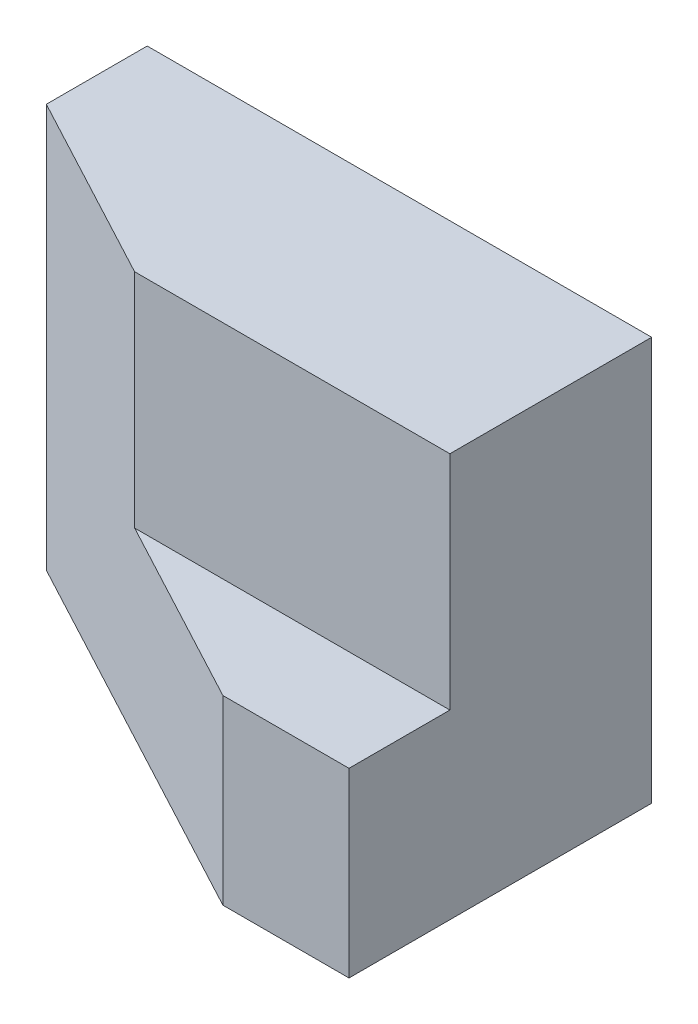
ISO-10303-21;
HEADER;
FILE_DESCRIPTION(('STEP AP214'),'2;1');
FILE_NAME('part.step','',(''),(''),'','','');
FILE_SCHEMA(('AUTOMOTIVE_DESIGN { 1 0 10303 214 1 1 1 1 }'));
ENDSEC;
DATA;
#1=APPLICATION_CONTEXT('core data for automotive mechanical design processes');
#2=APPLICATION_PROTOCOL_DEFINITION('international standard','automotive_design',2000,#1);
#3=PRODUCT_CONTEXT('',#1,'mechanical');
#4=PRODUCT('Part','Part','',(#3));
#5=PRODUCT_RELATED_PRODUCT_CATEGORY('part','',(#4));
#6=PRODUCT_DEFINITION_FORMATION('','',#4);
#7=PRODUCT_DEFINITION_CONTEXT('part definition',#1,'design');
#8=PRODUCT_DEFINITION('design','',#6,#7);
#9=PRODUCT_DEFINITION_SHAPE('','',#8);
#10=(LENGTH_UNIT() NAMED_UNIT(*) SI_UNIT(.MILLI.,.METRE.));
#11=(NAMED_UNIT(*) PLANE_ANGLE_UNIT() SI_UNIT($,.RADIAN.));
#12=(NAMED_UNIT(*) SI_UNIT($,.STERADIAN.) SOLID_ANGLE_UNIT());
#13=UNCERTAINTY_MEASURE_WITH_UNIT(LENGTH_MEASURE(1.E-05),#10,'distance_accuracy_value','');
#14=(GEOMETRIC_REPRESENTATION_CONTEXT(3) GLOBAL_UNCERTAINTY_ASSIGNED_CONTEXT((#13)) GLOBAL_UNIT_ASSIGNED_CONTEXT((#10,
#11,#12)) REPRESENTATION_CONTEXT('',''));
#15=CARTESIAN_POINT('',(0.,0.,0.));
#16=DIRECTION('',(0.,0.,1.));
#17=DIRECTION('',(1.,0.,0.));
#18=AXIS2_PLACEMENT_3D('',#15,#16,#17);
#19=CARTESIAN_POINT('',(0.,80.,0.));
#20=DIRECTION('',(0.,-1.,0.));
#21=DIRECTION('',(0.,0.,-1.));
#22=AXIS2_PLACEMENT_3D('',#19,#20,#21);
#23=PLANE('',#22);
#24=DIRECTION('',(-0.882352941176471,0.,-0.470588235294118));
#25=VECTOR('',#24,1.);
#26=CARTESIAN_POINT('',(75.,80.,60.));
#27=LINE('',#26,#25);
#28=CARTESIAN_POINT('',(37.5,80.,40.));
#29=VERTEX_POINT('',#28);
#30=CARTESIAN_POINT('',(0.,80.,20.));
#31=VERTEX_POINT('',#30);
#32=EDGE_CURVE('E88',#29,#31,#27,.T.);
#33=ORIENTED_EDGE('',*,*,#32,.F.);
#34=DIRECTION('',(1.,0.,0.));
#35=VECTOR('',#34,1.);
#36=CARTESIAN_POINT('',(0.,80.,40.));
#37=LINE('',#36,#35);
#38=CARTESIAN_POINT('',(100.,80.,40.));
#39=VERTEX_POINT('',#38);
#40=EDGE_CURVE('E127',#29,#39,#37,.T.);
#41=ORIENTED_EDGE('',*,*,#40,.T.);
#42=DIRECTION('',(0.,0.,1.));
#43=VECTOR('',#42,1.);
#44=CARTESIAN_POINT('',(100.,80.,0.));
#45=LINE('',#44,#43);
#46=CARTESIAN_POINT('',(100.,80.,0.));
#47=VERTEX_POINT('',#46);
#48=EDGE_CURVE('E285',#47,#39,#45,.T.);
#49=ORIENTED_EDGE('',*,*,#48,.F.);
#50=DIRECTION('',(1.,0.,0.));
#51=VECTOR('',#50,1.);
#52=CARTESIAN_POINT('',(0.,80.,0.));
#53=LINE('',#52,#51);
#54=CARTESIAN_POINT('',(0.,80.,0.));
#55=VERTEX_POINT('',#54);
#56=EDGE_CURVE('E291',#55,#47,#53,.T.);
#57=ORIENTED_EDGE('',*,*,#56,.F.);
#58=DIRECTION('',(0.,0.,-1.));
#59=VECTOR('',#58,1.);
#60=CARTESIAN_POINT('',(0.,80.,20.));
#61=LINE('',#60,#59);
#62=EDGE_CURVE('E289',#31,#55,#61,.T.);
#63=ORIENTED_EDGE('',*,*,#62,.F.);
#64=EDGE_LOOP('',(#33,#41,#49,#57,#63));
#65=FACE_BOUND('',#64,.T.);
#66=ADVANCED_FACE('F63',(#65),#23,.F.);
#67=CARTESIAN_POINT('',(0.,0.,0.));
#68=DIRECTION('',(0.,-1.,0.));
#69=DIRECTION('',(0.,0.,-1.));
#70=AXIS2_PLACEMENT_3D('',#67,#68,#69);
#71=PLANE('',#70);
#72=DIRECTION('',(0.,0.,-1.));
#73=VECTOR('',#72,1.);
#74=CARTESIAN_POINT('',(0.,0.,20.));
#75=LINE('',#74,#73);
#76=CARTESIAN_POINT('',(0.,0.,20.));
#77=VERTEX_POINT('',#76);
#78=CARTESIAN_POINT('',(0.,0.,0.));
#79=VERTEX_POINT('',#78);
#80=EDGE_CURVE('E144',#77,#79,#75,.T.);
#81=ORIENTED_EDGE('',*,*,#80,.T.);
#82=DIRECTION('',(1.,0.,0.));
#83=VECTOR('',#82,1.);
#84=CARTESIAN_POINT('',(0.,0.,0.));
#85=LINE('',#84,#83);
#86=CARTESIAN_POINT('',(100.,0.,0.));
#87=VERTEX_POINT('',#86);
#88=EDGE_CURVE('E147',#79,#87,#85,.T.);
#89=ORIENTED_EDGE('',*,*,#88,.T.);
#90=DIRECTION('',(0.,0.,1.));
#91=VECTOR('',#90,1.);
#92=CARTESIAN_POINT('',(100.,0.,0.));
#93=LINE('',#92,#91);
#94=CARTESIAN_POINT('',(100.,0.,60.));
#95=VERTEX_POINT('',#94);
#96=EDGE_CURVE('E256',#87,#95,#93,.T.);
#97=ORIENTED_EDGE('',*,*,#96,.T.);
#98=DIRECTION('',(-1.,0.,0.));
#99=VECTOR('',#98,1.);
#100=CARTESIAN_POINT('',(100.,0.,60.));
#101=LINE('',#100,#99);
#102=CARTESIAN_POINT('',(75.,0.,60.));
#103=VERTEX_POINT('',#102);
#104=EDGE_CURVE('E242',#95,#103,#101,.T.);
#105=ORIENTED_EDGE('',*,*,#104,.T.);
#106=DIRECTION('',(-0.882352941176471,0.,-0.470588235294118));
#107=VECTOR('',#106,1.);
#108=CARTESIAN_POINT('',(75.,0.,60.));
#109=LINE('',#108,#107);
#110=EDGE_CURVE('E296',#103,#77,#109,.T.);
#111=ORIENTED_EDGE('',*,*,#110,.T.);
#112=EDGE_LOOP('',(#81,#89,#97,#105,#111));
#113=FACE_BOUND('',#112,.T.);
#114=ADVANCED_FACE('F178',(#113),#71,.T.);
#115=CARTESIAN_POINT('',(0.,0.,0.));
#116=DIRECTION('',(-1.,0.,0.));
#117=DIRECTION('',(0.,0.,1.));
#118=AXIS2_PLACEMENT_3D('',#115,#116,#117);
#119=PLANE('',#118);
#120=CARTESIAN_POINT('',(0.,0.,20.));
#121=DIRECTION('',(0.,1.,0.));
#122=VECTOR('',#121,1.);
#123=LINE('',#120,#122);
#124=EDGE_CURVE('E294',#77,#31,#123,.T.);
#125=ORIENTED_EDGE('',*,*,#124,.T.);
#126=ORIENTED_EDGE('',*,*,#62,.T.);
#127=CARTESIAN_POINT('',(0.,0.,0.));
#128=DIRECTION('',(0.,1.,0.));
#129=VECTOR('',#128,1.);
#130=LINE('',#127,#129);
#131=EDGE_CURVE('E161',#79,#55,#130,.T.);
#132=ORIENTED_EDGE('',*,*,#131,.F.);
#133=ORIENTED_EDGE('',*,*,#80,.F.);
#134=EDGE_LOOP('',(#125,#126,#132,#133));
#135=FACE_BOUND('',#134,.T.);
#136=ADVANCED_FACE('F167',(#135),#119,.T.);
#137=CARTESIAN_POINT('',(0.,0.,0.));
#138=DIRECTION('',(0.,0.,-1.));
#139=DIRECTION('',(-1.,0.,0.));
#140=AXIS2_PLACEMENT_3D('',#137,#138,#139);
#141=PLANE('',#140);
#142=ORIENTED_EDGE('',*,*,#131,.T.);
#143=ORIENTED_EDGE('',*,*,#56,.T.);
#144=CARTESIAN_POINT('',(100.,0.,0.));
#145=DIRECTION('',(0.,1.,0.));
#146=VECTOR('',#145,1.);
#147=LINE('',#144,#146);
#148=EDGE_CURVE('E284',#87,#47,#147,.T.);
#149=ORIENTED_EDGE('',*,*,#148,.F.);
#150=ORIENTED_EDGE('',*,*,#88,.F.);
#151=EDGE_LOOP('',(#142,#143,#149,#150));
#152=FACE_BOUND('',#151,.T.);
#153=ADVANCED_FACE('F177',(#152),#141,.T.);
#154=CARTESIAN_POINT('',(-8.3044982698962,0.,15.5709342560554));
#155=DIRECTION('',(-0.470588235294118,0.,0.882352941176471));
#156=DIRECTION('',(0.882352941176471,0.,0.470588235294118));
#157=AXIS2_PLACEMENT_3D('',#154,#155,#156);
#158=PLANE('',#157);
#159=DIRECTION('',(0.882352941176471,0.,0.470588235294118));
#160=VECTOR('',#159,1.);
#161=CARTESIAN_POINT('',(-8.3044982698962,36.,15.5709342560554));
#162=LINE('',#161,#160);
#163=CARTESIAN_POINT('',(37.5,36.,40.));
#164=VERTEX_POINT('',#163);
#165=CARTESIAN_POINT('',(75.,36.,60.));
#166=VERTEX_POINT('',#165);
#167=EDGE_CURVE('E134',#164,#166,#162,.T.);
#168=ORIENTED_EDGE('',*,*,#167,.F.);
#169=DIRECTION('',(0.,-1.,0.));
#170=VECTOR('',#169,1.);
#171=CARTESIAN_POINT('',(37.5,0.,40.));
#172=LINE('',#171,#170);
#173=EDGE_CURVE('E124',#29,#164,#172,.T.);
#174=ORIENTED_EDGE('',*,*,#173,.F.);
#175=ORIENTED_EDGE('',*,*,#32,.T.);
#176=ORIENTED_EDGE('',*,*,#124,.F.);
#177=ORIENTED_EDGE('',*,*,#110,.F.);
#178=CARTESIAN_POINT('',(75.,0.,60.));
#179=DIRECTION('',(0.,1.,0.));
#180=VECTOR('',#179,1.);
#181=LINE('',#178,#180);
#182=EDGE_CURVE('E142',#103,#166,#181,.T.);
#183=ORIENTED_EDGE('',*,*,#182,.T.);
#184=EDGE_LOOP('',(#168,#174,#175,#176,#177,#183));
#185=FACE_BOUND('',#184,.T.);
#186=ADVANCED_FACE('F140',(#185),#158,.T.);
#187=CARTESIAN_POINT('',(0.,0.,60.));
#188=DIRECTION('',(0.,0.,1.));
#189=DIRECTION('',(1.,0.,0.));
#190=AXIS2_PLACEMENT_3D('',#187,#188,#189);
#191=PLANE('',#190);
#192=DIRECTION('',(1.,0.,0.));
#193=VECTOR('',#192,1.);
#194=CARTESIAN_POINT('',(0.,36.,60.));
#195=LINE('',#194,#193);
#196=CARTESIAN_POINT('',(100.,36.,60.));
#197=VERTEX_POINT('',#196);
#198=EDGE_CURVE('E129',#166,#197,#195,.T.);
#199=ORIENTED_EDGE('',*,*,#198,.F.);
#200=ORIENTED_EDGE('',*,*,#182,.F.);
#201=ORIENTED_EDGE('',*,*,#104,.F.);
#202=CARTESIAN_POINT('',(100.,0.,60.));
#203=DIRECTION('',(0.,1.,0.));
#204=VECTOR('',#203,1.);
#205=LINE('',#202,#204);
#206=EDGE_CURVE('E290',#95,#197,#205,.T.);
#207=ORIENTED_EDGE('',*,*,#206,.T.);
#208=EDGE_LOOP('',(#199,#200,#201,#207));
#209=FACE_BOUND('',#208,.T.);
#210=ADVANCED_FACE('F214',(#209),#191,.T.);
#211=CARTESIAN_POINT('',(100.,0.,0.));
#212=DIRECTION('',(1.,0.,0.));
#213=DIRECTION('',(0.,0.,-1.));
#214=AXIS2_PLACEMENT_3D('',#211,#212,#213);
#215=PLANE('',#214);
#216=DIRECTION('',(0.,0.,-1.));
#217=VECTOR('',#216,1.);
#218=CARTESIAN_POINT('',(100.,36.,0.));
#219=LINE('',#218,#217);
#220=CARTESIAN_POINT('',(100.,36.,40.));
#221=VERTEX_POINT('',#220);
#222=EDGE_CURVE('E12',#197,#221,#219,.T.);
#223=ORIENTED_EDGE('',*,*,#222,.F.);
#224=ORIENTED_EDGE('',*,*,#206,.F.);
#225=ORIENTED_EDGE('',*,*,#96,.F.);
#226=ORIENTED_EDGE('',*,*,#148,.T.);
#227=ORIENTED_EDGE('',*,*,#48,.T.);
#228=DIRECTION('',(0.,1.,0.));
#229=VECTOR('',#228,1.);
#230=CARTESIAN_POINT('',(100.,0.,40.));
#231=LINE('',#230,#229);
#232=EDGE_CURVE('E73',#221,#39,#231,.T.);
#233=ORIENTED_EDGE('',*,*,#232,.F.);
#234=EDGE_LOOP('',(#223,#224,#225,#226,#227,#233));
#235=FACE_BOUND('',#234,.T.);
#236=ADVANCED_FACE('F261',(#235),#215,.T.);
#237=CARTESIAN_POINT('',(0.,36.,0.));
#238=DIRECTION('',(0.,-1.,0.));
#239=DIRECTION('',(0.,0.,-1.));
#240=AXIS2_PLACEMENT_3D('',#237,#238,#239);
#241=PLANE('',#240);
#242=ORIENTED_EDGE('',*,*,#167,.T.);
#243=ORIENTED_EDGE('',*,*,#198,.T.);
#244=ORIENTED_EDGE('',*,*,#222,.T.);
#245=DIRECTION('',(1.,0.,0.));
#246=VECTOR('',#245,1.);
#247=CARTESIAN_POINT('',(-5.,36.,40.));
#248=LINE('',#247,#246);
#249=EDGE_CURVE('E67',#164,#221,#248,.T.);
#250=ORIENTED_EDGE('',*,*,#249,.F.);
#251=EDGE_LOOP('',(#242,#243,#244,#250));
#252=FACE_BOUND('',#251,.T.);
#253=ADVANCED_FACE('F133',(#252),#241,.F.);
#254=CARTESIAN_POINT('',(0.,0.,40.));
#255=DIRECTION('',(0.,0.,-1.));
#256=DIRECTION('',(-1.,0.,0.));
#257=AXIS2_PLACEMENT_3D('',#254,#255,#256);
#258=PLANE('',#257);
#259=ORIENTED_EDGE('',*,*,#173,.T.);
#260=ORIENTED_EDGE('',*,*,#249,.T.);
#261=ORIENTED_EDGE('',*,*,#232,.T.);
#262=ORIENTED_EDGE('',*,*,#40,.F.);
#263=EDGE_LOOP('',(#259,#260,#261,#262));
#264=FACE_BOUND('',#263,.T.);
#265=ADVANCED_FACE('F125',(#264),#258,.F.);
#266=CLOSED_SHELL('',(#66,#114,#136,#153,#186,#210,#236,#253,#265));
#267=MANIFOLD_SOLID_BREP('B2',#266);
#268=ADVANCED_BREP_SHAPE_REPRESENTATION('',(#18,#267),#14);
#269=SHAPE_DEFINITION_REPRESENTATION(#9,#268);
ENDSEC;
END-ISO-10303-21;
